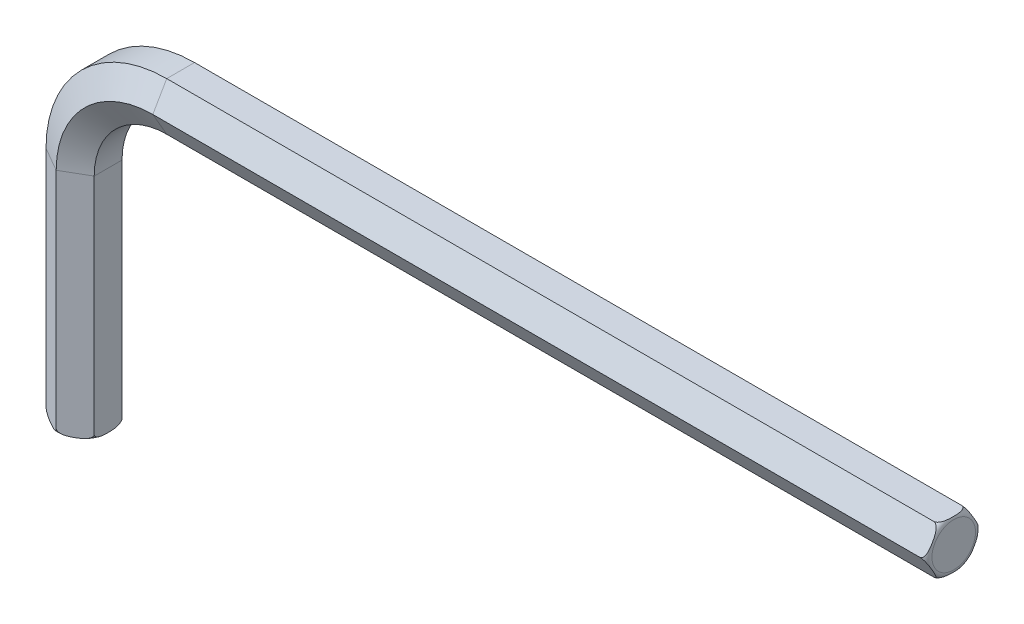
ISO-10303-21;
HEADER;
FILE_DESCRIPTION(('STEP AP214'),'2;1');
FILE_NAME('part.step','',(''),(''),'','','');
FILE_SCHEMA(('AUTOMOTIVE_DESIGN { 1 0 10303 214 1 1 1 1 }'));
ENDSEC;
DATA;
#1=APPLICATION_CONTEXT('core data for automotive mechanical design processes');
#2=APPLICATION_PROTOCOL_DEFINITION('international standard','automotive_design',2000,#1);
#3=PRODUCT_CONTEXT('',#1,'mechanical');
#4=PRODUCT('Part','Part','',(#3));
#5=PRODUCT_RELATED_PRODUCT_CATEGORY('part','',(#4));
#6=PRODUCT_DEFINITION_FORMATION('','',#4);
#7=PRODUCT_DEFINITION_CONTEXT('part definition',#1,'design');
#8=PRODUCT_DEFINITION('design','',#6,#7);
#9=PRODUCT_DEFINITION_SHAPE('','',#8);
#10=(LENGTH_UNIT() NAMED_UNIT(*) SI_UNIT(.MILLI.,.METRE.));
#11=(NAMED_UNIT(*) PLANE_ANGLE_UNIT() SI_UNIT($,.RADIAN.));
#12=(NAMED_UNIT(*) SI_UNIT($,.STERADIAN.) SOLID_ANGLE_UNIT());
#13=UNCERTAINTY_MEASURE_WITH_UNIT(LENGTH_MEASURE(1.E-05),#10,'distance_accuracy_value','');
#14=(GEOMETRIC_REPRESENTATION_CONTEXT(3) GLOBAL_UNCERTAINTY_ASSIGNED_CONTEXT((#13)) GLOBAL_UNIT_ASSIGNED_CONTEXT((#10,
#11,#12)) REPRESENTATION_CONTEXT('',''));
#15=CARTESIAN_POINT('',(0.,0.,0.));
#16=DIRECTION('',(0.,0.,1.));
#17=DIRECTION('',(1.,0.,0.));
#18=AXIS2_PLACEMENT_3D('',#15,#16,#17);
#19=CARTESIAN_POINT('',(0.,0.,0.));
#20=DIRECTION('',(0.,-1.,0.));
#21=DIRECTION('',(0.,0.,-1.));
#22=AXIS2_PLACEMENT_3D('',#19,#20,#21);
#23=PLANE('',#22);
#24=CARTESIAN_POINT('',(0.,0.,0.));
#25=DIRECTION('',(0.,-1.,0.));
#26=DIRECTION('',(0.,0.,1.));
#27=AXIS2_PLACEMENT_3D('',#24,#25,#26);
#28=CIRCLE('',#27,1.8036275740666);
#29=CARTESIAN_POINT('',(0.,0.,-1.8036275740666));
#30=VERTEX_POINT('',#29);
#31=EDGE_CURVE('E280',#30,#30,#28,.T.);
#32=ORIENTED_EDGE('',*,*,#31,.T.);
#33=EDGE_LOOP('',(#32));
#34=FACE_BOUND('',#33,.T.);
#35=ADVANCED_FACE('F16',(#34),#23,.T.);
#36=CARTESIAN_POINT('',(72.005,27.005,0.));
#37=DIRECTION('',(-1.,0.,0.));
#38=DIRECTION('',(0.,1.,0.));
#39=AXIS2_PLACEMENT_3D('',#36,#37,#38);
#40=PLANE('',#39);
#41=CARTESIAN_POINT('',(72.005,27.005,0.));
#42=DIRECTION('',(1.,0.,0.));
#43=DIRECTION('',(0.,0.,1.));
#44=AXIS2_PLACEMENT_3D('',#41,#42,#43);
#45=CIRCLE('',#44,1.80362757406661);
#46=CARTESIAN_POINT('',(72.005,27.005,-1.80362757406661));
#47=VERTEX_POINT('',#46);
#48=EDGE_CURVE('E260',#47,#47,#45,.T.);
#49=ORIENTED_EDGE('',*,*,#48,.T.);
#50=EDGE_LOOP('',(#49));
#51=FACE_BOUND('',#50,.T.);
#52=ADVANCED_FACE('F358',(#51),#40,.F.);
#53=CARTESIAN_POINT('',(0.,0.,-2.30362757406661));
#54=DIRECTION('',(-0.5,0.,-0.866025403784438));
#55=DIRECTION('',(-0.866025403784438,0.,0.5));
#56=AXIS2_PLACEMENT_3D('',#53,#54,#55);
#57=PLANE('',#56);
#58=CARTESIAN_POINT('',(0.,0.499999999999999,-2.30362757406661));
#59=CARTESIAN_POINT('',(0.,0.343158728298815,-2.30362757406661));
#60=CARTESIAN_POINT('',(-0.149467185827722,0.227267221612479,-2.21733265409395));
#61=CARTESIAN_POINT('',(-0.253000898598125,0.146990886045273,-2.15755743715576));
#62=CARTESIAN_POINT('',(-0.414112079202709,0.10082473982557,-2.06453985366425));
#63=CARTESIAN_POINT('',(-0.63300332750995,0.0381018093768951,-1.93816293253081));
#64=CARTESIAN_POINT('',(-0.997500000000001,0.0380729553356157,-1.72772068054995));
#65=CARTESIAN_POINT('',(-1.36112045049432,0.0380441706572348,-1.51778431557421));
#66=CARTESIAN_POINT('',(-1.58088792079729,0.100824739825571,-1.39090150743566));
#67=CARTESIAN_POINT('',(-1.74110063673021,0.146592411812725,-1.29840265276419));
#68=CARTESIAN_POINT('',(-1.84553281417228,0.22726722161248,-1.23810870700595));
#69=CARTESIAN_POINT('',(-1.995,0.342731986240649,-1.1518137870333));
#70=CARTESIAN_POINT('',(-1.995,0.499999999999999,-1.1518137870333));
#71=B_SPLINE_CURVE_WITH_KNOTS('',2,(#58,#59,#60,#61,#62,#63,#64,#65,#66,#67,#68,#69,#70),
.UNSPECIFIED.,.F.,.F.,(3,2,2,2,2,2,3),(0.,0.125,0.25,0.5,0.75,0.875,1.),.UNSPECIFIED.);
#72=CARTESIAN_POINT('',(0.,0.5,-2.30362757406661));
#73=VERTEX_POINT('',#72);
#74=CARTESIAN_POINT('',(-1.995,0.5,-1.15181378703331));
#75=VERTEX_POINT('',#74);
#76=EDGE_CURVE('E340',#73,#75,#71,.T.);
#77=ORIENTED_EDGE('',*,*,#76,.T.);
#78=DIRECTION('',(0.,1.,0.));
#79=VECTOR('',#78,1.);
#80=CARTESIAN_POINT('',(-1.995,0.,-1.1518137870333));
#81=LINE('',#80,#79);
#82=CARTESIAN_POINT('',(-1.995,19.005,-1.1518137870333));
#83=VERTEX_POINT('',#82);
#84=EDGE_CURVE('E10',#75,#83,#81,.T.);
#85=ORIENTED_EDGE('',*,*,#84,.T.);
#86=DIRECTION('',(-0.866025403784438,0.,0.5));
#87=VECTOR('',#86,1.);
#88=CARTESIAN_POINT('',(-1.995,19.005,-1.1518137870333));
#89=LINE('',#88,#87);
#90=CARTESIAN_POINT('',(0.,19.005,-2.30362757406661));
#91=VERTEX_POINT('',#90);
#92=EDGE_CURVE('E314',#91,#83,#89,.T.);
#93=ORIENTED_EDGE('',*,*,#92,.F.);
#94=DIRECTION('',(0.,1.,0.));
#95=VECTOR('',#94,1.);
#96=CARTESIAN_POINT('',(0.,0.,-2.30362757406661));
#97=LINE('',#96,#95);
#98=EDGE_CURVE('E30',#73,#91,#97,.T.);
#99=ORIENTED_EDGE('',*,*,#98,.F.);
#100=EDGE_LOOP('',(#77,#85,#93,#99));
#101=FACE_BOUND('',#100,.T.);
#102=ADVANCED_FACE('F347',(#101),#57,.T.);
#103=CARTESIAN_POINT('',(-1.995,0.,-1.1518137870333));
#104=DIRECTION('',(-1.,0.,0.));
#105=DIRECTION('',(0.,1.,0.));
#106=AXIS2_PLACEMENT_3D('',#103,#104,#105);
#107=PLANE('',#106);
#108=CARTESIAN_POINT('',(-1.995,0.5,-1.15181378703331));
#109=CARTESIAN_POINT('',(-1.995,0.343158728298807,-1.15181378703331));
#110=CARTESIAN_POINT('',(-1.995,0.227267221612481,-0.979223947088011));
#111=CARTESIAN_POINT('',(-1.995,0.146990886045278,-0.859673513211621));
#112=CARTESIAN_POINT('',(-1.995,0.10082473982557,-0.673638346228591));
#113=CARTESIAN_POINT('',(-1.995,0.038101809376895,-0.42088450396174));
#114=CARTESIAN_POINT('',(-1.995,0.0380729553356157,0.));
#115=CARTESIAN_POINT('',(-1.995,0.0380441706572347,0.41987272995147));
#116=CARTESIAN_POINT('',(-1.995,0.100824739825572,0.673638346228595));
#117=CARTESIAN_POINT('',(-1.995,0.146592411812712,0.858636055571495));
#118=CARTESIAN_POINT('',(-1.995,0.227267221612484,0.979223947088015));
#119=CARTESIAN_POINT('',(-1.995,0.342731986240635,1.15181378703331));
#120=CARTESIAN_POINT('',(-1.995,0.5,1.15181378703331));
#121=B_SPLINE_CURVE_WITH_KNOTS('',2,(#108,#109,#110,#111,#112,#113,#114,#115,#116,#117,#118,
#119,#120),.UNSPECIFIED.,.F.,.F.,(3,2,2,2,2,2,3),(0.,0.125,0.25,0.5,0.75,0.875,1.),.UNSPECIFIED.);
#122=CARTESIAN_POINT('',(-1.995,0.5,1.1518137870333));
#123=VERTEX_POINT('',#122);
#124=EDGE_CURVE('E530',#75,#123,#121,.T.);
#125=ORIENTED_EDGE('',*,*,#124,.T.);
#126=DIRECTION('',(0.,1.,0.));
#127=VECTOR('',#126,1.);
#128=CARTESIAN_POINT('',(-1.995,0.,1.1518137870333));
#129=LINE('',#128,#127);
#130=CARTESIAN_POINT('',(-1.995,19.005,1.1518137870333));
#131=VERTEX_POINT('',#130);
#132=EDGE_CURVE('E304',#123,#131,#129,.T.);
#133=ORIENTED_EDGE('',*,*,#132,.T.);
#134=DIRECTION('',(0.,0.,1.));
#135=VECTOR('',#134,1.);
#136=CARTESIAN_POINT('',(-1.995,19.005,1.1518137870333));
#137=LINE('',#136,#135);
#138=EDGE_CURVE('E315',#83,#131,#137,.T.);
#139=ORIENTED_EDGE('',*,*,#138,.F.);
#140=ORIENTED_EDGE('',*,*,#84,.F.);
#141=EDGE_LOOP('',(#125,#133,#139,#140));
#142=FACE_BOUND('',#141,.T.);
#143=ADVANCED_FACE('F357',(#142),#107,.T.);
#144=CARTESIAN_POINT('',(1.995,0.,-1.15181378703331));
#145=DIRECTION('',(0.5,0.,-0.866025403784439));
#146=DIRECTION('',(0.,-1.,0.));
#147=AXIS2_PLACEMENT_3D('',#144,#145,#146);
#148=PLANE('',#147);
#149=CARTESIAN_POINT('',(1.99499999999998,0.5,-1.15181378703332));
#150=CARTESIAN_POINT('',(1.99499999999998,0.343158728298851,-1.15181378703332));
#151=CARTESIAN_POINT('',(1.84553281417227,0.227267221612484,-1.23810870700597));
#152=CARTESIAN_POINT('',(1.74199910140188,0.146990886045272,-1.29788392394415));
#153=CARTESIAN_POINT('',(1.58088792079728,0.100824739825576,-1.39090150743567));
#154=CARTESIAN_POINT('',(1.36199667248998,0.038101809376898,-1.51727842856915));
#155=CARTESIAN_POINT('',(0.997499999999994,0.0380729553356187,-1.72772068054996));
#156=CARTESIAN_POINT('',(0.63387954950581,0.0380441706572377,-1.93765704552563));
#157=CARTESIAN_POINT('',(0.414112079202702,0.100824739825575,-2.06453985366426));
#158=CARTESIAN_POINT('',(0.253899363269838,0.146592411812689,-2.1570387083357));
#159=CARTESIAN_POINT('',(0.149467185827721,0.227267221612483,-2.21733265409396));
#160=CARTESIAN_POINT('',(0.,0.342731986240659,-2.30362757406661));
#161=CARTESIAN_POINT('',(0.,0.5,-2.30362757406661));
#162=B_SPLINE_CURVE_WITH_KNOTS('',2,(#149,#150,#151,#152,#153,#154,#155,#156,#157,#158,#159,
#160,#161),.UNSPECIFIED.,.F.,.F.,(3,2,2,2,2,2,3),(0.,0.125,0.25,0.5,0.75,0.875,1.),.UNSPECIFIED.);
#163=CARTESIAN_POINT('',(1.995,0.5,-1.15181378703332));
#164=VERTEX_POINT('',#163);
#165=EDGE_CURVE('E485',#164,#73,#162,.T.);
#166=ORIENTED_EDGE('',*,*,#165,.T.);
#167=ORIENTED_EDGE('',*,*,#98,.T.);
#168=DIRECTION('',(-0.866025403784439,0.,-0.5));
#169=VECTOR('',#168,1.);
#170=CARTESIAN_POINT('',(0.,19.005,-2.30362757406661));
#171=LINE('',#170,#169);
#172=CARTESIAN_POINT('',(1.995,19.005,-1.15181378703331));
#173=VERTEX_POINT('',#172);
#174=EDGE_CURVE('E292',#173,#91,#171,.T.);
#175=ORIENTED_EDGE('',*,*,#174,.F.);
#176=DIRECTION('',(0.,1.,0.));
#177=VECTOR('',#176,1.);
#178=CARTESIAN_POINT('',(1.995,0.,-1.15181378703331));
#179=LINE('',#178,#177);
#180=EDGE_CURVE('E298',#164,#173,#179,.T.);
#181=ORIENTED_EDGE('',*,*,#180,.F.);
#182=EDGE_LOOP('',(#166,#167,#175,#181));
#183=FACE_BOUND('',#182,.T.);
#184=ADVANCED_FACE('F490',(#183),#148,.T.);
#185=CARTESIAN_POINT('',(8.,19.005,-1.72772068054996));
#186=DIRECTION('',(0.,0.,1.));
#187=DIRECTION('',(0.,-1.,0.));
#188=AXIS2_PLACEMENT_3D('',#185,#186,#187);
#189=CONICAL_SURFACE('',#188,8.9975,1.0471975511966);
#190=ORIENTED_EDGE('',*,*,#92,.T.);
#191=CARTESIAN_POINT('',(8.,19.005,-1.1518137870333));
#192=DIRECTION('',(0.,0.,-1.));
#193=DIRECTION('',(-1.,0.,0.));
#194=AXIS2_PLACEMENT_3D('',#191,#192,#193);
#195=CIRCLE('',#194,9.995);
#196=CARTESIAN_POINT('',(8.,29.,-1.1518137870333));
#197=VERTEX_POINT('',#196);
#198=EDGE_CURVE('E311',#83,#197,#195,.T.);
#199=ORIENTED_EDGE('',*,*,#198,.T.);
#200=DIRECTION('',(0.,0.866025403784438,0.5));
#201=VECTOR('',#200,1.);
#202=CARTESIAN_POINT('',(8.,29.,-1.1518137870333));
#203=LINE('',#202,#201);
#204=CARTESIAN_POINT('',(8.,27.005,-2.30362757406661));
#205=VERTEX_POINT('',#204);
#206=EDGE_CURVE('E274',#205,#197,#203,.T.);
#207=ORIENTED_EDGE('',*,*,#206,.F.);
#208=CARTESIAN_POINT('',(8.,19.005,-2.30362757406661));
#209=DIRECTION('',(0.,0.,-1.));
#210=DIRECTION('',(-1.,0.,0.));
#211=AXIS2_PLACEMENT_3D('',#208,#209,#210);
#212=CIRCLE('',#211,8.);
#213=EDGE_CURVE('E327',#91,#205,#212,.T.);
#214=ORIENTED_EDGE('',*,*,#213,.F.);
#215=EDGE_LOOP('',(#190,#199,#207,#214));
#216=FACE_BOUND('',#215,.T.);
#217=ADVANCED_FACE('F446',(#216),#189,.T.);
#218=CARTESIAN_POINT('',(8.,19.005,0.));
#219=DIRECTION('',(0.,0.,-1.));
#220=DIRECTION('',(0.,-1.,0.));
#221=AXIS2_PLACEMENT_3D('',#218,#219,#220);
#222=CYLINDRICAL_SURFACE('',#221,9.995);
#223=ORIENTED_EDGE('',*,*,#138,.T.);
#224=CARTESIAN_POINT('',(8.,19.005,1.1518137870333));
#225=DIRECTION('',(0.,0.,-1.));
#226=DIRECTION('',(-1.,0.,0.));
#227=AXIS2_PLACEMENT_3D('',#224,#225,#226);
#228=CIRCLE('',#227,9.995);
#229=CARTESIAN_POINT('',(8.,29.,1.1518137870333));
#230=VERTEX_POINT('',#229);
#231=EDGE_CURVE('E335',#131,#230,#228,.T.);
#232=ORIENTED_EDGE('',*,*,#231,.T.);
#233=DIRECTION('',(0.,0.,1.));
#234=VECTOR('',#233,1.);
#235=CARTESIAN_POINT('',(8.,29.,1.1518137870333));
#236=LINE('',#235,#234);
#237=EDGE_CURVE('E234',#197,#230,#236,.T.);
#238=ORIENTED_EDGE('',*,*,#237,.F.);
#239=ORIENTED_EDGE('',*,*,#198,.F.);
#240=EDGE_LOOP('',(#223,#232,#238,#239));
#241=FACE_BOUND('',#240,.T.);
#242=ADVANCED_FACE('F503',(#241),#222,.T.);
#243=CARTESIAN_POINT('',(8.,19.005,1.72772068054995));
#244=DIRECTION('',(0.,0.,-1.));
#245=DIRECTION('',(0.,-1.,0.));
#246=AXIS2_PLACEMENT_3D('',#243,#244,#245);
#247=CONICAL_SURFACE('',#246,8.9975,1.0471975511966);
#248=DIRECTION('',(0.866025403784439,0.,0.5));
#249=VECTOR('',#248,1.);
#250=CARTESIAN_POINT('',(0.,19.005,2.3036275740666));
#251=LINE('',#250,#249);
#252=CARTESIAN_POINT('',(0.,19.005,2.3036275740666));
#253=VERTEX_POINT('',#252);
#254=EDGE_CURVE('E300',#131,#253,#251,.T.);
#255=ORIENTED_EDGE('',*,*,#254,.T.);
#256=CARTESIAN_POINT('',(8.,19.005,2.3036275740666));
#257=DIRECTION('',(0.,0.,-1.));
#258=DIRECTION('',(-1.,0.,0.));
#259=AXIS2_PLACEMENT_3D('',#256,#257,#258);
#260=CIRCLE('',#259,8.);
#261=CARTESIAN_POINT('',(8.,27.005,2.3036275740666));
#262=VERTEX_POINT('',#261);
#263=EDGE_CURVE('E309',#253,#262,#260,.T.);
#264=ORIENTED_EDGE('',*,*,#263,.T.);
#265=DIRECTION('',(0.,-0.866025403784439,0.5));
#266=VECTOR('',#265,1.);
#267=CARTESIAN_POINT('',(8.,27.005,2.3036275740666));
#268=LINE('',#267,#266);
#269=EDGE_CURVE('E318',#230,#262,#268,.T.);
#270=ORIENTED_EDGE('',*,*,#269,.F.);
#271=ORIENTED_EDGE('',*,*,#231,.F.);
#272=EDGE_LOOP('',(#255,#264,#270,#271));
#273=FACE_BOUND('',#272,.T.);
#274=ADVANCED_FACE('F359',(#273),#247,.T.);
#275=CARTESIAN_POINT('',(8.,19.005,1.72772068054995));
#276=DIRECTION('',(0.,0.,1.));
#277=DIRECTION('',(0.,-1.,0.));
#278=AXIS2_PLACEMENT_3D('',#275,#276,#277);
#279=CONICAL_SURFACE('',#278,7.0025,1.0471975511966);
#280=DIRECTION('',(0.866025403784438,0.,-0.5));
#281=VECTOR('',#280,1.);
#282=CARTESIAN_POINT('',(1.995,19.005,1.1518137870333));
#283=LINE('',#282,#281);
#284=CARTESIAN_POINT('',(1.995,19.005,1.1518137870333));
#285=VERTEX_POINT('',#284);
#286=EDGE_CURVE('E294',#253,#285,#283,.T.);
#287=ORIENTED_EDGE('',*,*,#286,.T.);
#288=CARTESIAN_POINT('',(8.,19.005,1.1518137870333));
#289=DIRECTION('',(0.,0.,-1.));
#290=DIRECTION('',(-1.,0.,0.));
#291=AXIS2_PLACEMENT_3D('',#288,#289,#290);
#292=CIRCLE('',#291,6.005);
#293=CARTESIAN_POINT('',(8.,25.01,1.1518137870333));
#294=VERTEX_POINT('',#293);
#295=EDGE_CURVE('E306',#285,#294,#292,.T.);
#296=ORIENTED_EDGE('',*,*,#295,.T.);
#297=DIRECTION('',(0.,-0.866025403784438,-0.5));
#298=VECTOR('',#297,1.);
#299=CARTESIAN_POINT('',(8.,25.01,1.1518137870333));
#300=LINE('',#299,#298);
#301=EDGE_CURVE('E816',#262,#294,#300,.T.);
#302=ORIENTED_EDGE('',*,*,#301,.F.);
#303=ORIENTED_EDGE('',*,*,#263,.F.);
#304=EDGE_LOOP('',(#287,#296,#302,#303));
#305=FACE_BOUND('',#304,.T.);
#306=ADVANCED_FACE('F579',(#305),#279,.F.);
#307=CARTESIAN_POINT('',(8.,19.005,0.));
#308=DIRECTION('',(0.,0.,-1.));
#309=DIRECTION('',(0.,-1.,0.));
#310=AXIS2_PLACEMENT_3D('',#307,#308,#309);
#311=CYLINDRICAL_SURFACE('',#310,6.005);
#312=DIRECTION('',(0.,0.,-1.));
#313=VECTOR('',#312,1.);
#314=CARTESIAN_POINT('',(1.995,19.005,-1.15181378703331));
#315=LINE('',#314,#313);
#316=EDGE_CURVE('E153',#285,#173,#315,.T.);
#317=ORIENTED_EDGE('',*,*,#316,.T.);
#318=CARTESIAN_POINT('',(8.,19.005,-1.15181378703331));
#319=DIRECTION('',(0.,0.,-1.));
#320=DIRECTION('',(-1.,0.,0.));
#321=AXIS2_PLACEMENT_3D('',#318,#319,#320);
#322=CIRCLE('',#321,6.005);
#323=CARTESIAN_POINT('',(8.,25.01,-1.15181378703331));
#324=VERTEX_POINT('',#323);
#325=EDGE_CURVE('E310',#173,#324,#322,.T.);
#326=ORIENTED_EDGE('',*,*,#325,.T.);
#327=DIRECTION('',(0.,0.,-1.));
#328=VECTOR('',#327,1.);
#329=CARTESIAN_POINT('',(8.,25.01,-1.15181378703331));
#330=LINE('',#329,#328);
#331=EDGE_CURVE('E147',#294,#324,#330,.T.);
#332=ORIENTED_EDGE('',*,*,#331,.F.);
#333=ORIENTED_EDGE('',*,*,#295,.F.);
#334=EDGE_LOOP('',(#317,#326,#332,#333));
#335=FACE_BOUND('',#334,.T.);
#336=ADVANCED_FACE('F365',(#335),#311,.F.);
#337=CARTESIAN_POINT('',(8.,19.005,-1.72772068054996));
#338=DIRECTION('',(0.,0.,-1.));
#339=DIRECTION('',(0.,-1.,0.));
#340=AXIS2_PLACEMENT_3D('',#337,#338,#339);
#341=CONICAL_SURFACE('',#340,7.0025,1.0471975511966);
#342=ORIENTED_EDGE('',*,*,#174,.T.);
#343=ORIENTED_EDGE('',*,*,#213,.T.);
#344=DIRECTION('',(0.,0.866025403784439,-0.5));
#345=VECTOR('',#344,1.);
#346=CARTESIAN_POINT('',(8.,27.005,-2.30362757406661));
#347=LINE('',#346,#345);
#348=EDGE_CURVE('E152',#324,#205,#347,.T.);
#349=ORIENTED_EDGE('',*,*,#348,.F.);
#350=ORIENTED_EDGE('',*,*,#325,.F.);
#351=EDGE_LOOP('',(#342,#343,#349,#350));
#352=FACE_BOUND('',#351,.T.);
#353=ADVANCED_FACE('F361',(#352),#341,.F.);
#354=CARTESIAN_POINT('',(8.,27.005,2.3036275740666));
#355=DIRECTION('',(0.,-0.5,0.866025403784438));
#356=DIRECTION('',(-1.,0.,0.));
#357=AXIS2_PLACEMENT_3D('',#354,#355,#356);
#358=PLANE('',#357);
#359=CARTESIAN_POINT('',(71.505,25.01,1.1518137870333));
#360=CARTESIAN_POINT('',(71.6618412717047,25.01,1.1518137870333));
#361=CARTESIAN_POINT('',(71.7777327783875,25.1594671858277,1.23810870700595));
#362=CARTESIAN_POINT('',(71.8580091139509,25.2630008985965,1.29788392394318));
#363=CARTESIAN_POINT('',(71.9041752601744,25.4241120792027,1.39090150743567));
#364=CARTESIAN_POINT('',(71.966898190616,25.6430033274694,1.51727842854569));
#365=CARTESIAN_POINT('',(71.9669270446644,26.0075,1.72772068054995));
#366=CARTESIAN_POINT('',(71.9669558293499,26.3711204504746,1.93765704551433));
#367=CARTESIAN_POINT('',(71.9041752601744,26.5908879207973,2.06453985366423));
#368=CARTESIAN_POINT('',(71.8584075881853,26.7511006367331,2.15703870833739));
#369=CARTESIAN_POINT('',(71.7777327783875,26.8555328141723,2.21733265409394));
#370=CARTESIAN_POINT('',(71.6622680137588,27.005,2.3036275740666));
#371=CARTESIAN_POINT('',(71.505,27.005,2.3036275740666));
#372=B_SPLINE_CURVE_WITH_KNOTS('',2,(#359,#360,#361,#362,#363,#364,#365,#366,#367,#368,#369,
#370,#371),.UNSPECIFIED.,.F.,.F.,(3,2,2,2,2,2,3),(0.,0.125,0.25,0.5,0.75,0.875,1.),.UNSPECIFIED.);
#373=CARTESIAN_POINT('',(71.505,25.01,1.15181378703329));
#374=VERTEX_POINT('',#373);
#375=CARTESIAN_POINT('',(71.505,27.005,2.30362757406661));
#376=VERTEX_POINT('',#375);
#377=EDGE_CURVE('E172',#374,#376,#372,.T.);
#378=ORIENTED_EDGE('',*,*,#377,.T.);
#379=DIRECTION('',(1.,0.,0.));
#380=VECTOR('',#379,1.);
#381=CARTESIAN_POINT('',(8.,27.005,2.3036275740666));
#382=LINE('',#381,#380);
#383=EDGE_CURVE('E235',#262,#376,#382,.T.);
#384=ORIENTED_EDGE('',*,*,#383,.F.);
#385=ORIENTED_EDGE('',*,*,#301,.T.);
#386=DIRECTION('',(1.,0.,0.));
#387=VECTOR('',#386,1.);
#388=CARTESIAN_POINT('',(8.,25.01,1.1518137870333));
#389=LINE('',#388,#387);
#390=EDGE_CURVE('E183',#294,#374,#389,.T.);
#391=ORIENTED_EDGE('',*,*,#390,.T.);
#392=EDGE_LOOP('',(#378,#384,#385,#391));
#393=FACE_BOUND('',#392,.T.);
#394=ADVANCED_FACE('F364',(#393),#358,.T.);
#395=CARTESIAN_POINT('',(8.,25.01,1.1518137870333));
#396=DIRECTION('',(0.,-1.,0.));
#397=DIRECTION('',(0.,0.,-1.));
#398=AXIS2_PLACEMENT_3D('',#395,#396,#397);
#399=PLANE('',#398);
#400=CARTESIAN_POINT('',(71.505,25.01,-1.15181378703331));
#401=CARTESIAN_POINT('',(71.6618412717051,25.01,-1.15181378703331));
#402=CARTESIAN_POINT('',(71.7777327783875,25.01,-0.979223947088));
#403=CARTESIAN_POINT('',(71.8580091139586,25.01,-0.85967351320173));
#404=CARTESIAN_POINT('',(71.9041752601744,25.01,-0.673638346228585));
#405=CARTESIAN_POINT('',(71.966898190616,25.01,-0.420884503982395));
#406=CARTESIAN_POINT('',(71.9669270446644,25.01,0.));
#407=CARTESIAN_POINT('',(71.9669558293499,25.01,0.4198727299283));
#408=CARTESIAN_POINT('',(71.9041752601744,25.01,0.673638346228577));
#409=CARTESIAN_POINT('',(71.8584075881832,25.01,0.858636055583749));
#410=CARTESIAN_POINT('',(71.7777327783875,25.01,0.979223947087991));
#411=CARTESIAN_POINT('',(71.6622680137534,25.01,1.15181378703329));
#412=CARTESIAN_POINT('',(71.505,25.01,1.15181378703329));
#413=B_SPLINE_CURVE_WITH_KNOTS('',2,(#400,#401,#402,#403,#404,#405,#406,#407,#408,#409,#410,
#411,#412),.UNSPECIFIED.,.F.,.F.,(3,2,2,2,2,2,3),(0.,0.125,0.25,0.5,0.75,0.875,1.),.UNSPECIFIED.);
#414=CARTESIAN_POINT('',(71.505,25.01,-1.15181378703331));
#415=VERTEX_POINT('',#414);
#416=EDGE_CURVE('E143',#415,#374,#413,.T.);
#417=ORIENTED_EDGE('',*,*,#416,.T.);
#418=ORIENTED_EDGE('',*,*,#390,.F.);
#419=ORIENTED_EDGE('',*,*,#331,.T.);
#420=DIRECTION('',(1.,0.,0.));
#421=VECTOR('',#420,1.);
#422=CARTESIAN_POINT('',(8.,25.01,-1.15181378703331));
#423=LINE('',#422,#421);
#424=EDGE_CURVE('E138',#324,#415,#423,.T.);
#425=ORIENTED_EDGE('',*,*,#424,.T.);
#426=EDGE_LOOP('',(#417,#418,#419,#425));
#427=FACE_BOUND('',#426,.T.);
#428=ADVANCED_FACE('F140',(#427),#399,.T.);
#429=CARTESIAN_POINT('',(8.,25.01,-1.15181378703331));
#430=DIRECTION('',(0.,-0.5,-0.866025403784439));
#431=DIRECTION('',(0.,-0.866025403784439,0.5));
#432=AXIS2_PLACEMENT_3D('',#429,#430,#431);
#433=PLANE('',#432);
#434=CARTESIAN_POINT('',(71.505,27.005,-2.30362757406661));
#435=CARTESIAN_POINT('',(71.6618412717001,27.005,-2.30362757406661));
#436=CARTESIAN_POINT('',(71.7777327783876,26.8555328141723,-2.21733265409397));
#437=CARTESIAN_POINT('',(71.8580091139485,26.7519991014111,-2.15755743716109));
#438=CARTESIAN_POINT('',(71.9041752601744,26.5908879207973,-2.06453985366426));
#439=CARTESIAN_POINT('',(71.966898190616,26.3719966725321,-1.9381629325551));
#440=CARTESIAN_POINT('',(71.9669270446644,26.0075,-1.72772068054996));
#441=CARTESIAN_POINT('',(71.9669558293499,25.6438795495246,-1.51778431558511));
#442=CARTESIAN_POINT('',(71.9041752601744,25.4241120792027,-1.39090150743569));
#443=CARTESIAN_POINT('',(71.8584075881848,25.2638993632656,-1.2984026527618));
#444=CARTESIAN_POINT('',(71.7777327783876,25.1594671858277,-1.23810870700596));
#445=CARTESIAN_POINT('',(71.6622680137584,25.01,-1.15181378703331));
#446=CARTESIAN_POINT('',(71.505,25.01,-1.15181378703331));
#447=B_SPLINE_CURVE_WITH_KNOTS('',2,(#434,#435,#436,#437,#438,#439,#440,#441,#442,#443,#444,
#445,#446),.UNSPECIFIED.,.F.,.F.,(3,2,2,2,2,2,3),(0.,0.125,0.25,0.5,0.75,0.875,1.),.UNSPECIFIED.);
#448=CARTESIAN_POINT('',(71.505,27.005,-2.30362757406661));
#449=VERTEX_POINT('',#448);
#450=EDGE_CURVE('E156',#449,#415,#447,.T.);
#451=ORIENTED_EDGE('',*,*,#450,.T.);
#452=ORIENTED_EDGE('',*,*,#424,.F.);
#453=ORIENTED_EDGE('',*,*,#348,.T.);
#454=DIRECTION('',(1.,0.,0.));
#455=VECTOR('',#454,1.);
#456=CARTESIAN_POINT('',(8.,27.005,-2.30362757406661));
#457=LINE('',#456,#455);
#458=EDGE_CURVE('E159',#205,#449,#457,.T.);
#459=ORIENTED_EDGE('',*,*,#458,.T.);
#460=EDGE_LOOP('',(#451,#452,#453,#459));
#461=FACE_BOUND('',#460,.T.);
#462=ADVANCED_FACE('F18',(#461),#433,.T.);
#463=CARTESIAN_POINT('',(1.995,0.,1.1518137870333));
#464=DIRECTION('',(1.,0.,0.));
#465=DIRECTION('',(0.,0.,-1.));
#466=AXIS2_PLACEMENT_3D('',#463,#464,#465);
#467=PLANE('',#466);
#468=CARTESIAN_POINT('',(1.995,0.5,1.15181378703329));
#469=CARTESIAN_POINT('',(1.995,0.3431587282988,1.15181378703329));
#470=CARTESIAN_POINT('',(1.995,0.227267221612488,0.979223947087986));
#471=CARTESIAN_POINT('',(1.995,0.146990886045285,0.859673513211578));
#472=CARTESIAN_POINT('',(1.995,0.100824739825579,0.673638346228574));
#473=CARTESIAN_POINT('',(1.995,0.0381018093769011,0.42088450396174));
#474=CARTESIAN_POINT('',(1.995,0.0380729553356218,0.));
#475=CARTESIAN_POINT('',(1.995,0.0380441706572408,-0.41987272995146));
#476=CARTESIAN_POINT('',(1.995,0.100824739825577,-0.67363834622858));
#477=CARTESIAN_POINT('',(1.995,0.146592411812715,-0.85863605557147));
#478=CARTESIAN_POINT('',(1.995,0.227267221612486,-0.97922394708799));
#479=CARTESIAN_POINT('',(1.995,0.342731986240634,-1.15181378703329));
#480=CARTESIAN_POINT('',(1.995,0.5,-1.15181378703329));
#481=B_SPLINE_CURVE_WITH_KNOTS('',2,(#468,#469,#470,#471,#472,#473,#474,#475,#476,#477,#478,
#479,#480),.UNSPECIFIED.,.F.,.F.,(3,2,2,2,2,2,3),(0.,0.125,0.25,0.5,0.75,0.875,1.),.UNSPECIFIED.);
#482=CARTESIAN_POINT('',(1.995,0.5,1.15181378703328));
#483=VERTEX_POINT('',#482);
#484=EDGE_CURVE('E519',#483,#164,#481,.T.);
#485=ORIENTED_EDGE('',*,*,#484,.T.);
#486=ORIENTED_EDGE('',*,*,#180,.T.);
#487=ORIENTED_EDGE('',*,*,#316,.F.);
#488=DIRECTION('',(0.,1.,0.));
#489=VECTOR('',#488,1.);
#490=CARTESIAN_POINT('',(1.995,0.,1.1518137870333));
#491=LINE('',#490,#489);
#492=EDGE_CURVE('E299',#483,#285,#491,.T.);
#493=ORIENTED_EDGE('',*,*,#492,.F.);
#494=EDGE_LOOP('',(#485,#486,#487,#493));
#495=FACE_BOUND('',#494,.T.);
#496=ADVANCED_FACE('F411',(#495),#467,.T.);
#497=CARTESIAN_POINT('',(0.,0.,2.3036275740666));
#498=DIRECTION('',(0.5,0.,0.866025403784438));
#499=DIRECTION('',(0.,-1.,0.));
#500=AXIS2_PLACEMENT_3D('',#497,#498,#499);
#501=PLANE('',#500);
#502=CARTESIAN_POINT('',(0.,0.5,2.3036275740666));
#503=CARTESIAN_POINT('',(0.,0.343158728298824,2.3036275740666));
#504=CARTESIAN_POINT('',(0.149467185827727,0.227267221612486,2.21733265409395));
#505=CARTESIAN_POINT('',(0.253000898598121,0.146990886045282,2.15755743715576));
#506=CARTESIAN_POINT('',(0.414112079202713,0.100824739825577,2.06453985366424));
#507=CARTESIAN_POINT('',(0.633003327509879,0.0381018093769232,1.93816293253085));
#508=CARTESIAN_POINT('',(0.997499999999997,0.0380729553356215,1.72772068054995));
#509=CARTESIAN_POINT('',(1.36112045049418,0.0380441706572182,1.51778431557428));
#510=CARTESIAN_POINT('',(1.58088792079729,0.100824739825576,1.39090150743566));
#511=CARTESIAN_POINT('',(1.74110063673017,0.14659241181271,1.29840265276421));
#512=CARTESIAN_POINT('',(1.84553281417227,0.227267221612485,1.23810870700595));
#513=CARTESIAN_POINT('',(1.995,0.34273198624065,1.1518137870333));
#514=CARTESIAN_POINT('',(1.995,0.5,1.1518137870333));
#515=B_SPLINE_CURVE_WITH_KNOTS('',2,(#502,#503,#504,#505,#506,#507,#508,#509,#510,#511,#512,
#513,#514),.UNSPECIFIED.,.F.,.F.,(3,2,2,2,2,2,3),(0.,0.125,0.25,0.5,0.75,0.875,1.),.UNSPECIFIED.);
#516=CARTESIAN_POINT('',(0.,0.5,2.3036275740666));
#517=VERTEX_POINT('',#516);
#518=EDGE_CURVE('E432',#517,#483,#515,.T.);
#519=ORIENTED_EDGE('',*,*,#518,.T.);
#520=ORIENTED_EDGE('',*,*,#492,.T.);
#521=ORIENTED_EDGE('',*,*,#286,.F.);
#522=DIRECTION('',(0.,1.,0.));
#523=VECTOR('',#522,1.);
#524=CARTESIAN_POINT('',(0.,0.,2.3036275740666));
#525=LINE('',#524,#523);
#526=EDGE_CURVE('E305',#517,#253,#525,.T.);
#527=ORIENTED_EDGE('',*,*,#526,.F.);
#528=EDGE_LOOP('',(#519,#520,#521,#527));
#529=FACE_BOUND('',#528,.T.);
#530=ADVANCED_FACE('F406',(#529),#501,.T.);
#531=CARTESIAN_POINT('',(-1.995,0.,1.1518137870333));
#532=DIRECTION('',(-0.5,0.,0.866025403784439));
#533=DIRECTION('',(0.,1.,0.));
#534=AXIS2_PLACEMENT_3D('',#531,#532,#533);
#535=PLANE('',#534);
#536=CARTESIAN_POINT('',(-1.99500000000001,0.5,1.1518137870333));
#537=CARTESIAN_POINT('',(-1.99500000000001,0.343158728298864,1.1518137870333));
#538=CARTESIAN_POINT('',(-1.84553281417228,0.227267221612482,1.23810870700595));
#539=CARTESIAN_POINT('',(-1.74199910140195,0.146990886045303,1.2978839239441));
#540=CARTESIAN_POINT('',(-1.5808879207973,0.100824739825573,1.39090150743565));
#541=CARTESIAN_POINT('',(-1.36199667249009,0.0381018093768982,1.51727842856907));
#542=CARTESIAN_POINT('',(-0.997500000000006,0.0380729553356188,1.72772068054995));
#543=CARTESIAN_POINT('',(-0.633879549505732,0.0380441706572378,1.93765704552567));
#544=CARTESIAN_POINT('',(-0.41411207920271,0.100824739825574,2.06453985366424));
#545=CARTESIAN_POINT('',(-0.253899363269898,0.14659241181269,2.15703870833565));
#546=CARTESIAN_POINT('',(-0.149467185827725,0.227267221612483,2.21733265409395));
#547=CARTESIAN_POINT('',(0.,0.342731986240594,2.3036275740666));
#548=CARTESIAN_POINT('',(0.,0.5,2.3036275740666));
#549=B_SPLINE_CURVE_WITH_KNOTS('',2,(#536,#537,#538,#539,#540,#541,#542,#543,#544,#545,#546,
#547,#548),.UNSPECIFIED.,.F.,.F.,(3,2,2,2,2,2,3),(0.,0.125,0.25,0.5,0.75,0.875,1.),.UNSPECIFIED.);
#550=EDGE_CURVE('E539',#123,#517,#549,.T.);
#551=ORIENTED_EDGE('',*,*,#550,.T.);
#552=ORIENTED_EDGE('',*,*,#526,.T.);
#553=ORIENTED_EDGE('',*,*,#254,.F.);
#554=ORIENTED_EDGE('',*,*,#132,.F.);
#555=EDGE_LOOP('',(#551,#552,#553,#554));
#556=FACE_BOUND('',#555,.T.);
#557=ADVANCED_FACE('F410',(#556),#535,.T.);
#558=CARTESIAN_POINT('',(0.,0.5,0.));
#559=DIRECTION('',(0.,1.,0.));
#560=DIRECTION('',(0.,0.,1.));
#561=AXIS2_PLACEMENT_3D('',#558,#559,#560);
#562=TOROIDAL_SURFACE('',#561,1.80362757406661,0.5);
#563=ORIENTED_EDGE('',*,*,#31,.F.);
#564=CARTESIAN_POINT('',(0.,0.5,-1.80362757406661));
#565=DIRECTION('',(1.,0.,0.));
#566=DIRECTION('',(0.,0.,-1.));
#567=AXIS2_PLACEMENT_3D('',#564,#565,#566);
#568=CIRCLE('',#567,0.5);
#569=EDGE_CURVE('E333',#30,#73,#568,.T.);
#570=ORIENTED_EDGE('',*,*,#569,.T.);
#571=ORIENTED_EDGE('',*,*,#165,.F.);
#572=ORIENTED_EDGE('',*,*,#484,.F.);
#573=ORIENTED_EDGE('',*,*,#518,.F.);
#574=ORIENTED_EDGE('',*,*,#550,.F.);
#575=ORIENTED_EDGE('',*,*,#124,.F.);
#576=ORIENTED_EDGE('',*,*,#76,.F.);
#577=ORIENTED_EDGE('',*,*,#569,.F.);
#578=EDGE_LOOP('',(#563,#570,#571,#572,#573,#574,#575,#576,#577));
#579=FACE_BOUND('',#578,.T.);
#580=ADVANCED_FACE('F437',(#579),#562,.T.);
#581=CARTESIAN_POINT('',(8.,27.005,-2.30362757406661));
#582=DIRECTION('',(0.,0.5,-0.866025403784438));
#583=DIRECTION('',(-1.,0.,0.));
#584=AXIS2_PLACEMENT_3D('',#581,#582,#583);
#585=PLANE('',#584);
#586=CARTESIAN_POINT('',(71.505,29.,-1.1518137870333));
#587=CARTESIAN_POINT('',(71.6618412716943,29.,-1.1518137870333));
#588=CARTESIAN_POINT('',(71.7777327783876,28.8505328141723,-1.23810870700595));
#589=CARTESIAN_POINT('',(71.858009113954,28.746999101409,-1.29788392394001));
#590=CARTESIAN_POINT('',(71.9041752601744,28.5858879207973,-1.39090150743566));
#591=CARTESIAN_POINT('',(71.966898190616,28.3669966725086,-1.51727842855841));
#592=CARTESIAN_POINT('',(71.9669270446644,28.0025,-1.72772068054996));
#593=CARTESIAN_POINT('',(71.9669558293499,27.6388795495481,-1.93765704550123));
#594=CARTESIAN_POINT('',(71.9041752601744,27.4191120792027,-2.06453985366423));
#595=CARTESIAN_POINT('',(71.858407588193,27.2588993632772,-2.15703870833145));
#596=CARTESIAN_POINT('',(71.7777327783876,27.1544671858277,-2.21733265409396));
#597=CARTESIAN_POINT('',(71.6622680137594,27.005,-2.30362757406661));
#598=CARTESIAN_POINT('',(71.505,27.005,-2.30362757406661));
#599=B_SPLINE_CURVE_WITH_KNOTS('',2,(#586,#587,#588,#589,#590,#591,#592,#593,#594,#595,#596,
#597,#598),.UNSPECIFIED.,.F.,.F.,(3,2,2,2,2,2,3),(0.,0.125,0.25,0.5,0.75,0.875,1.),.UNSPECIFIED.);
#600=CARTESIAN_POINT('',(71.505,29.,-1.15181378703331));
#601=VERTEX_POINT('',#600);
#602=EDGE_CURVE('E241',#601,#449,#599,.T.);
#603=ORIENTED_EDGE('',*,*,#602,.T.);
#604=ORIENTED_EDGE('',*,*,#458,.F.);
#605=ORIENTED_EDGE('',*,*,#206,.T.);
#606=DIRECTION('',(1.,0.,0.));
#607=VECTOR('',#606,1.);
#608=CARTESIAN_POINT('',(8.,29.,-1.1518137870333));
#609=LINE('',#608,#607);
#610=EDGE_CURVE('E226',#197,#601,#609,.T.);
#611=ORIENTED_EDGE('',*,*,#610,.T.);
#612=EDGE_LOOP('',(#603,#604,#605,#611));
#613=FACE_BOUND('',#612,.T.);
#614=ADVANCED_FACE('F195',(#613),#585,.T.);
#615=CARTESIAN_POINT('',(8.,29.,-1.1518137870333));
#616=DIRECTION('',(0.,1.,0.));
#617=DIRECTION('',(0.,0.,-1.));
#618=AXIS2_PLACEMENT_3D('',#615,#616,#617);
#619=PLANE('',#618);
#620=CARTESIAN_POINT('',(71.505,29.,1.15181378703331));
#621=CARTESIAN_POINT('',(71.6618412717051,29.,1.15181378703331));
#622=CARTESIAN_POINT('',(71.7777327783875,29.,0.97922394708801));
#623=CARTESIAN_POINT('',(71.8580091139664,29.,0.859673513190215));
#624=CARTESIAN_POINT('',(71.9041752601744,29.,0.67363834622859));
#625=CARTESIAN_POINT('',(71.966898190616,29.,0.42088450395515));
#626=CARTESIAN_POINT('',(71.9669270446644,29.,0.));
#627=CARTESIAN_POINT('',(71.9669558293499,29.,-0.419872729928315));
#628=CARTESIAN_POINT('',(71.9041752601744,29.,-0.673638346228592));
#629=CARTESIAN_POINT('',(71.8584075881831,29.,-0.858636055583904));
#630=CARTESIAN_POINT('',(71.7777327783875,29.,-0.979223947088011));
#631=CARTESIAN_POINT('',(71.6622680137535,29.,-1.15181378703331));
#632=CARTESIAN_POINT('',(71.505,29.,-1.15181378703331));
#633=B_SPLINE_CURVE_WITH_KNOTS('',2,(#620,#621,#622,#623,#624,#625,#626,#627,#628,#629,#630,
#631,#632),.UNSPECIFIED.,.F.,.F.,(3,2,2,2,2,2,3),(0.,0.125,0.25,0.5,0.75,0.875,1.),.UNSPECIFIED.);
#634=CARTESIAN_POINT('',(71.505,29.,1.1518137870333));
#635=VERTEX_POINT('',#634);
#636=EDGE_CURVE('E251',#635,#601,#633,.T.);
#637=ORIENTED_EDGE('',*,*,#636,.T.);
#638=ORIENTED_EDGE('',*,*,#610,.F.);
#639=ORIENTED_EDGE('',*,*,#237,.T.);
#640=DIRECTION('',(1.,0.,0.));
#641=VECTOR('',#640,1.);
#642=CARTESIAN_POINT('',(8.,29.,1.1518137870333));
#643=LINE('',#642,#641);
#644=EDGE_CURVE('E164',#230,#635,#643,.T.);
#645=ORIENTED_EDGE('',*,*,#644,.T.);
#646=EDGE_LOOP('',(#637,#638,#639,#645));
#647=FACE_BOUND('',#646,.T.);
#648=ADVANCED_FACE('F198',(#647),#619,.T.);
#649=CARTESIAN_POINT('',(8.,29.,1.1518137870333));
#650=DIRECTION('',(0.,0.5,0.866025403784439));
#651=DIRECTION('',(1.,0.,0.));
#652=AXIS2_PLACEMENT_3D('',#649,#650,#651);
#653=PLANE('',#652);
#654=CARTESIAN_POINT('',(71.505,27.005,2.3036275740666));
#655=CARTESIAN_POINT('',(71.6618412717,27.005,2.3036275740666));
#656=CARTESIAN_POINT('',(71.7777327783876,27.1544671858277,2.21733265409395));
#657=CARTESIAN_POINT('',(71.8580091139485,27.2580008985889,2.15755743716107));
#658=CARTESIAN_POINT('',(71.9041752601744,27.4191120792027,2.06453985366423));
#659=CARTESIAN_POINT('',(71.966898190616,27.6380033274679,1.93816293255508));
#660=CARTESIAN_POINT('',(71.9669270446644,28.0025,1.72772068054995));
#661=CARTESIAN_POINT('',(71.9669558293499,28.3661204504753,1.51778431558516));
#662=CARTESIAN_POINT('',(71.9041752601744,28.5858879207973,1.39090150743567));
#663=CARTESIAN_POINT('',(71.8584075881869,28.7461006367269,1.29840265276609));
#664=CARTESIAN_POINT('',(71.7777327783876,28.8505328141723,1.23810870700595));
#665=CARTESIAN_POINT('',(71.6622680137636,29.,1.1518137870333));
#666=CARTESIAN_POINT('',(71.505,29.,1.1518137870333));
#667=B_SPLINE_CURVE_WITH_KNOTS('',2,(#654,#655,#656,#657,#658,#659,#660,#661,#662,#663,#664,
#665,#666),.UNSPECIFIED.,.F.,.F.,(3,2,2,2,2,2,3),(0.,0.125,0.25,0.5,0.75,0.875,1.),.UNSPECIFIED.);
#668=EDGE_CURVE('E259',#376,#635,#667,.T.);
#669=ORIENTED_EDGE('',*,*,#668,.T.);
#670=ORIENTED_EDGE('',*,*,#644,.F.);
#671=ORIENTED_EDGE('',*,*,#269,.T.);
#672=ORIENTED_EDGE('',*,*,#383,.T.);
#673=EDGE_LOOP('',(#669,#670,#671,#672));
#674=FACE_BOUND('',#673,.T.);
#675=ADVANCED_FACE('F194',(#674),#653,.T.);
#676=CARTESIAN_POINT('',(71.505,27.005,0.));
#677=DIRECTION('',(-1.,0.,0.));
#678=DIRECTION('',(0.,0.,1.));
#679=AXIS2_PLACEMENT_3D('',#676,#677,#678);
#680=TOROIDAL_SURFACE('',#679,1.80362757406661,0.5);
#681=ORIENTED_EDGE('',*,*,#48,.F.);
#682=CARTESIAN_POINT('',(71.505,27.005,-1.80362757406661));
#683=DIRECTION('',(0.,1.,0.));
#684=DIRECTION('',(0.,0.,-1.));
#685=AXIS2_PLACEMENT_3D('',#682,#683,#684);
#686=CIRCLE('',#685,0.5);
#687=EDGE_CURVE('E252',#47,#449,#686,.T.);
#688=ORIENTED_EDGE('',*,*,#687,.T.);
#689=ORIENTED_EDGE('',*,*,#602,.F.);
#690=ORIENTED_EDGE('',*,*,#636,.F.);
#691=ORIENTED_EDGE('',*,*,#668,.F.);
#692=ORIENTED_EDGE('',*,*,#377,.F.);
#693=ORIENTED_EDGE('',*,*,#416,.F.);
#694=ORIENTED_EDGE('',*,*,#450,.F.);
#695=ORIENTED_EDGE('',*,*,#687,.F.);
#696=EDGE_LOOP('',(#681,#688,#689,#690,#691,#692,#693,#694,#695));
#697=FACE_BOUND('',#696,.T.);
#698=ADVANCED_FACE('F169',(#697),#680,.T.);
#699=CLOSED_SHELL('',(#35,#52,#102,#143,#184,#217,#242,#274,#306,#336,#353,#394,#428,#462,#496,
#530,#557,#580,#614,#648,#675,#698));
#700=MANIFOLD_SOLID_BREP('B1',#699);
#701=ADVANCED_BREP_SHAPE_REPRESENTATION('',(#18,#700),#14);
#702=SHAPE_DEFINITION_REPRESENTATION(#9,#701);
ENDSEC;
END-ISO-10303-21;
